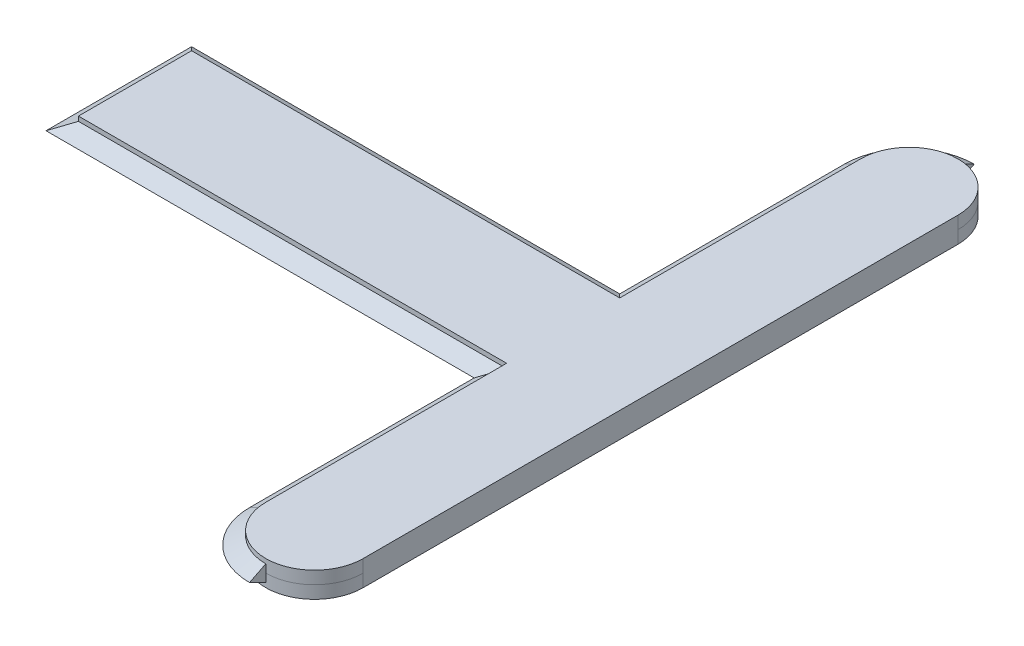
ISO-10303-21;
HEADER;
FILE_DESCRIPTION(('STEP AP214'),'2;1');
FILE_NAME('part.step','',(''),(''),'','','');
FILE_SCHEMA(('AUTOMOTIVE_DESIGN { 1 0 10303 214 1 1 1 1 }'));
ENDSEC;
DATA;
#1=APPLICATION_CONTEXT('core data for automotive mechanical design processes');
#2=APPLICATION_PROTOCOL_DEFINITION('international standard','automotive_design',2000,#1);
#3=PRODUCT_CONTEXT('',#1,'mechanical');
#4=PRODUCT('Part','Part','',(#3));
#5=PRODUCT_RELATED_PRODUCT_CATEGORY('part','',(#4));
#6=PRODUCT_DEFINITION_FORMATION('','',#4);
#7=PRODUCT_DEFINITION_CONTEXT('part definition',#1,'design');
#8=PRODUCT_DEFINITION('design','',#6,#7);
#9=PRODUCT_DEFINITION_SHAPE('','',#8);
#10=(LENGTH_UNIT() NAMED_UNIT(*) SI_UNIT(.MILLI.,.METRE.));
#11=(NAMED_UNIT(*) PLANE_ANGLE_UNIT() SI_UNIT($,.RADIAN.));
#12=(NAMED_UNIT(*) SI_UNIT($,.STERADIAN.) SOLID_ANGLE_UNIT());
#13=UNCERTAINTY_MEASURE_WITH_UNIT(LENGTH_MEASURE(1.E-05),#10,'distance_accuracy_value','');
#14=(GEOMETRIC_REPRESENTATION_CONTEXT(3) GLOBAL_UNCERTAINTY_ASSIGNED_CONTEXT((#13)) GLOBAL_UNIT_ASSIGNED_CONTEXT((#10,
#11,#12)) REPRESENTATION_CONTEXT('',''));
#15=CARTESIAN_POINT('',(0.,0.,0.));
#16=DIRECTION('',(0.,0.,1.));
#17=DIRECTION('',(1.,0.,0.));
#18=AXIS2_PLACEMENT_3D('',#15,#16,#17);
#19=CARTESIAN_POINT('',(0.,6.,-13.4215536280061));
#20=DIRECTION('',(1.,0.,0.));
#21=DIRECTION('',(0.,0.,-1.));
#22=AXIS2_PLACEMENT_3D('',#19,#20,#21);
#23=PLANE('',#22);
#24=DIRECTION('',(0.,0.,-1.));
#25=VECTOR('',#24,1.);
#26=CARTESIAN_POINT('',(0.,4.91034304153466,17.7565536280061));
#27=LINE('',#26,#25);
#28=CARTESIAN_POINT('',(0.,4.91034304153466,13.4215536280061));
#29=VERTEX_POINT('',#28);
#30=CARTESIAN_POINT('',(0.,4.91034304153466,-13.4215536280061));
#31=VERTEX_POINT('',#30);
#32=EDGE_CURVE('E260',#29,#31,#27,.T.);
#33=ORIENTED_EDGE('',*,*,#32,.F.);
#34=DIRECTION('',(0.,-1.,0.));
#35=VECTOR('',#34,1.);
#36=CARTESIAN_POINT('',(0.,6.,13.4215536280061));
#37=LINE('',#36,#35);
#38=CARTESIAN_POINT('',(0.,6.,13.4215536280061));
#39=VERTEX_POINT('',#38);
#40=EDGE_CURVE('E421',#39,#29,#37,.T.);
#41=ORIENTED_EDGE('',*,*,#40,.F.);
#42=DIRECTION('',(0.,0.,1.));
#43=VECTOR('',#42,1.);
#44=CARTESIAN_POINT('',(0.,6.,-13.4215536280061));
#45=LINE('',#44,#43);
#46=CARTESIAN_POINT('',(0.,6.,-13.4215536280061));
#47=VERTEX_POINT('',#46);
#48=EDGE_CURVE('E329',#47,#39,#45,.T.);
#49=ORIENTED_EDGE('',*,*,#48,.F.);
#50=DIRECTION('',(0.,-1.,0.));
#51=VECTOR('',#50,1.);
#52=CARTESIAN_POINT('',(0.,6.,-13.4215536280061));
#53=LINE('',#52,#51);
#54=EDGE_CURVE('E388',#47,#31,#53,.T.);
#55=ORIENTED_EDGE('',*,*,#54,.T.);
#56=EDGE_LOOP('',(#33,#41,#49,#55));
#57=FACE_BOUND('',#56,.T.);
#58=ADVANCED_FACE('F47',(#57),#23,.F.);
#59=CARTESIAN_POINT('',(101.6,6.,-70.5715536280061));
#60=DIRECTION('',(1.,0.,0.));
#61=DIRECTION('',(0.,0.,-1.));
#62=AXIS2_PLACEMENT_3D('',#59,#60,#61);
#63=PLANE('',#62);
#64=DIRECTION('',(0.,0.,-1.));
#65=VECTOR('',#64,1.);
#66=CARTESIAN_POINT('',(101.6,4.91034304153466,-13.4215536280061));
#67=LINE('',#66,#65);
#68=CARTESIAN_POINT('',(101.6,4.91034304153466,-13.4215536280061));
#69=VERTEX_POINT('',#68);
#70=CARTESIAN_POINT('',(101.6,4.91034304153466,-70.5715536280061));
#71=VERTEX_POINT('',#70);
#72=EDGE_CURVE('E303',#69,#71,#67,.T.);
#73=ORIENTED_EDGE('',*,*,#72,.F.);
#74=DIRECTION('',(0.,-1.,0.));
#75=VECTOR('',#74,1.);
#76=CARTESIAN_POINT('',(101.6,6.,-13.4215536280061));
#77=LINE('',#76,#75);
#78=CARTESIAN_POINT('',(101.6,6.,-13.4215536280061));
#79=VERTEX_POINT('',#78);
#80=EDGE_CURVE('E393',#79,#69,#77,.T.);
#81=ORIENTED_EDGE('',*,*,#80,.F.);
#82=DIRECTION('',(0.,0.,1.));
#83=VECTOR('',#82,1.);
#84=CARTESIAN_POINT('',(101.6,6.,-70.5715536280061));
#85=LINE('',#84,#83);
#86=CARTESIAN_POINT('',(101.6,6.,-70.5715536280061));
#87=VERTEX_POINT('',#86);
#88=EDGE_CURVE('E349',#87,#79,#85,.T.);
#89=ORIENTED_EDGE('',*,*,#88,.F.);
#90=DIRECTION('',(0.,-1.,0.));
#91=VECTOR('',#90,1.);
#92=CARTESIAN_POINT('',(101.6,6.,-70.5715536280061));
#93=LINE('',#92,#91);
#94=EDGE_CURVE('E397',#87,#71,#93,.T.);
#95=ORIENTED_EDGE('',*,*,#94,.T.);
#96=EDGE_LOOP('',(#73,#81,#89,#95));
#97=FACE_BOUND('',#96,.T.);
#98=ADVANCED_FACE('F526',(#97),#63,.F.);
#99=CARTESIAN_POINT('',(113.157,6.,-70.5715536280061));
#100=DIRECTION('',(0.,-1.,0.));
#101=DIRECTION('',(0.,0.,-1.));
#102=AXIS2_PLACEMENT_3D('',#99,#100,#101);
#103=CYLINDRICAL_SURFACE('',#102,11.557);
#104=DIRECTION('',(0.,-1.,0.));
#105=VECTOR('',#104,1.);
#106=CARTESIAN_POINT('',(113.157,4.91034304153466,-82.1285536280061));
#107=LINE('',#106,#105);
#108=CARTESIAN_POINT('',(113.157,4.91034304153466,-82.1285536280061));
#109=VERTEX_POINT('',#108);
#110=CARTESIAN_POINT('',(113.157,3.,-82.1285536280061));
#111=VERTEX_POINT('',#110);
#112=EDGE_CURVE('E66',#109,#111,#107,.T.);
#113=ORIENTED_EDGE('',*,*,#112,.F.);
#114=CARTESIAN_POINT('',(113.157,4.91034304153466,-70.5715536280061));
#115=DIRECTION('',(0.,-1.,0.));
#116=DIRECTION('',(-1.,0.,0.));
#117=AXIS2_PLACEMENT_3D('',#114,#115,#116);
#118=CIRCLE('',#117,11.557);
#119=EDGE_CURVE('E71',#71,#109,#118,.T.);
#120=ORIENTED_EDGE('',*,*,#119,.F.);
#121=ORIENTED_EDGE('',*,*,#94,.F.);
#122=CARTESIAN_POINT('',(113.157,6.,-70.5715536280061));
#123=DIRECTION('',(0.,1.,0.));
#124=DIRECTION('',(0.,0.,1.));
#125=AXIS2_PLACEMENT_3D('',#122,#123,#124);
#126=CIRCLE('',#125,11.557);
#127=CARTESIAN_POINT('',(124.714,6.,-70.5715536280061));
#128=VERTEX_POINT('',#127);
#129=EDGE_CURVE('E346',#128,#87,#126,.T.);
#130=ORIENTED_EDGE('',*,*,#129,.F.);
#131=DIRECTION('',(0.,-1.,0.));
#132=VECTOR('',#131,1.);
#133=CARTESIAN_POINT('',(124.714,6.,-70.5715536280061));
#134=LINE('',#133,#132);
#135=CARTESIAN_POINT('',(124.714,3.,-70.5715536280061));
#136=VERTEX_POINT('',#135);
#137=EDGE_CURVE('E401',#128,#136,#134,.T.);
#138=ORIENTED_EDGE('',*,*,#137,.T.);
#139=CARTESIAN_POINT('',(113.157,3.,-70.5715536280061));
#140=DIRECTION('',(0.,-1.,0.));
#141=DIRECTION('',(0.,0.,-1.));
#142=AXIS2_PLACEMENT_3D('',#139,#140,#141);
#143=CIRCLE('',#142,11.557);
#144=EDGE_CURVE('E57',#111,#136,#143,.T.);
#145=ORIENTED_EDGE('',*,*,#144,.F.);
#146=EDGE_LOOP('',(#113,#120,#121,#130,#138,#145));
#147=FACE_BOUND('',#146,.T.);
#148=ADVANCED_FACE('F557',(#147),#103,.T.);
#149=CARTESIAN_POINT('',(101.6,6.,13.4215536280061));
#150=DIRECTION('',(1.,0.,0.));
#151=DIRECTION('',(0.,0.,-1.));
#152=AXIS2_PLACEMENT_3D('',#149,#150,#151);
#153=PLANE('',#152);
#154=DIRECTION('',(0.,0.,-1.));
#155=VECTOR('',#154,1.);
#156=CARTESIAN_POINT('',(101.6,4.91034304153466,70.5715536280061));
#157=LINE('',#156,#155);
#158=CARTESIAN_POINT('',(101.6,4.91034304153468,70.5715536280061));
#159=VERTEX_POINT('',#158);
#160=CARTESIAN_POINT('',(101.6,4.91034304153468,13.4215536280061));
#161=VERTEX_POINT('',#160);
#162=EDGE_CURVE('E211',#159,#161,#157,.T.);
#163=ORIENTED_EDGE('',*,*,#162,.F.);
#164=DIRECTION('',(0.,-1.,0.));
#165=VECTOR('',#164,1.);
#166=CARTESIAN_POINT('',(101.6,6.,70.5715536280061));
#167=LINE('',#166,#165);
#168=CARTESIAN_POINT('',(101.6,6.,70.5715536280061));
#169=VERTEX_POINT('',#168);
#170=EDGE_CURVE('E411',#169,#159,#167,.T.);
#171=ORIENTED_EDGE('',*,*,#170,.F.);
#172=DIRECTION('',(0.,0.,1.));
#173=VECTOR('',#172,1.);
#174=CARTESIAN_POINT('',(101.6,6.,13.4215536280061));
#175=LINE('',#174,#173);
#176=CARTESIAN_POINT('',(101.6,6.,13.4215536280061));
#177=VERTEX_POINT('',#176);
#178=EDGE_CURVE('E337',#177,#169,#175,.T.);
#179=ORIENTED_EDGE('',*,*,#178,.F.);
#180=DIRECTION('',(0.,-1.,0.));
#181=VECTOR('',#180,1.);
#182=CARTESIAN_POINT('',(101.6,6.,13.4215536280061));
#183=LINE('',#182,#181);
#184=EDGE_CURVE('E416',#177,#161,#183,.T.);
#185=ORIENTED_EDGE('',*,*,#184,.T.);
#186=EDGE_LOOP('',(#163,#171,#179,#185));
#187=FACE_BOUND('',#186,.T.);
#188=ADVANCED_FACE('F476',(#187),#153,.F.);
#189=CARTESIAN_POINT('',(113.157,6.,70.5715536280061));
#190=DIRECTION('',(0.,-1.,0.));
#191=DIRECTION('',(0.,0.,-1.));
#192=AXIS2_PLACEMENT_3D('',#189,#190,#191);
#193=CYLINDRICAL_SURFACE('',#192,11.557);
#194=CARTESIAN_POINT('',(113.157,4.91034304153466,70.5715536280061));
#195=DIRECTION('',(0.,-1.,0.));
#196=DIRECTION('',(0.,0.,1.));
#197=AXIS2_PLACEMENT_3D('',#194,#195,#196);
#198=CIRCLE('',#197,11.5570000000001);
#199=CARTESIAN_POINT('',(113.157,4.91034304153468,82.1285536280061));
#200=VERTEX_POINT('',#199);
#201=EDGE_CURVE('E242',#200,#159,#198,.T.);
#202=ORIENTED_EDGE('',*,*,#201,.F.);
#203=DIRECTION('',(0.,-1.,0.));
#204=VECTOR('',#203,1.);
#205=CARTESIAN_POINT('',(113.157,4.91034304153466,82.1285536280061));
#206=LINE('',#205,#204);
#207=CARTESIAN_POINT('',(113.157,3.,82.1285536280061));
#208=VERTEX_POINT('',#207);
#209=EDGE_CURVE('E59',#200,#208,#206,.T.);
#210=ORIENTED_EDGE('',*,*,#209,.T.);
#211=CARTESIAN_POINT('',(113.157,3.,70.5715536280061));
#212=DIRECTION('',(0.,-1.,0.));
#213=DIRECTION('',(0.,0.,-1.));
#214=AXIS2_PLACEMENT_3D('',#211,#212,#213);
#215=CIRCLE('',#214,11.557);
#216=CARTESIAN_POINT('',(124.714,3.,70.5715536280061));
#217=VERTEX_POINT('',#216);
#218=EDGE_CURVE('E51',#217,#208,#215,.T.);
#219=ORIENTED_EDGE('',*,*,#218,.F.);
#220=DIRECTION('',(0.,-1.,0.));
#221=VECTOR('',#220,1.);
#222=CARTESIAN_POINT('',(124.714,6.,70.5715536280061));
#223=LINE('',#222,#221);
#224=CARTESIAN_POINT('',(124.714,6.,70.5715536280061));
#225=VERTEX_POINT('',#224);
#226=EDGE_CURVE('E406',#225,#217,#223,.T.);
#227=ORIENTED_EDGE('',*,*,#226,.F.);
#228=CARTESIAN_POINT('',(113.157,6.,70.5715536280061));
#229=DIRECTION('',(0.,1.,0.));
#230=DIRECTION('',(0.,0.,1.));
#231=AXIS2_PLACEMENT_3D('',#228,#229,#230);
#232=CIRCLE('',#231,11.557);
#233=EDGE_CURVE('E340',#169,#225,#232,.T.);
#234=ORIENTED_EDGE('',*,*,#233,.F.);
#235=ORIENTED_EDGE('',*,*,#170,.T.);
#236=EDGE_LOOP('',(#202,#210,#219,#227,#234,#235));
#237=FACE_BOUND('',#236,.T.);
#238=ADVANCED_FACE('F471',(#237),#193,.T.);
#239=CARTESIAN_POINT('',(0.,6.,13.4215536280061));
#240=DIRECTION('',(0.,0.,-1.));
#241=DIRECTION('',(-1.,0.,0.));
#242=AXIS2_PLACEMENT_3D('',#239,#240,#241);
#243=PLANE('',#242);
#244=DIRECTION('',(-1.,0.,0.));
#245=VECTOR('',#244,1.);
#246=CARTESIAN_POINT('',(101.6,4.91034304153466,13.4215536280061));
#247=LINE('',#246,#245);
#248=EDGE_CURVE('E224',#161,#29,#247,.T.);
#249=ORIENTED_EDGE('',*,*,#248,.F.);
#250=ORIENTED_EDGE('',*,*,#184,.F.);
#251=DIRECTION('',(1.,0.,0.));
#252=VECTOR('',#251,1.);
#253=CARTESIAN_POINT('',(0.,6.,13.4215536280061));
#254=LINE('',#253,#252);
#255=EDGE_CURVE('E333',#39,#177,#254,.T.);
#256=ORIENTED_EDGE('',*,*,#255,.F.);
#257=ORIENTED_EDGE('',*,*,#40,.T.);
#258=EDGE_LOOP('',(#249,#250,#256,#257));
#259=FACE_BOUND('',#258,.T.);
#260=ADVANCED_FACE('F479',(#259),#243,.F.);
#261=CARTESIAN_POINT('',(113.157,1.06034304153466,-82.1285536280061));
#262=VERTEX_POINT('',#261);
#263=EDGE_CURVE('E296',#111,#262,#107,.T.);
#264=ORIENTED_EDGE('',*,*,#263,.F.);
#265=ORIENTED_EDGE('',*,*,#144,.T.);
#266=CARTESIAN_POINT('',(124.714,0.,-70.5715536280061));
#267=VERTEX_POINT('',#266);
#268=EDGE_CURVE('E400',#136,#267,#134,.T.);
#269=ORIENTED_EDGE('',*,*,#268,.T.);
#270=CARTESIAN_POINT('',(113.157,0.,-70.5715536280061));
#271=DIRECTION('',(0.,1.,0.));
#272=DIRECTION('',(0.,0.,1.));
#273=AXIS2_PLACEMENT_3D('',#270,#271,#272);
#274=CIRCLE('',#273,11.557);
#275=CARTESIAN_POINT('',(101.6,0.,-70.5715536280061));
#276=VERTEX_POINT('',#275);
#277=EDGE_CURVE('E377',#267,#276,#274,.T.);
#278=ORIENTED_EDGE('',*,*,#277,.T.);
#279=CARTESIAN_POINT('',(101.6,1.06034304153466,-70.5715536280061));
#280=VERTEX_POINT('',#279);
#281=EDGE_CURVE('E396',#280,#276,#93,.T.);
#282=ORIENTED_EDGE('',*,*,#281,.F.);
#283=CARTESIAN_POINT('',(113.157,1.06034304153466,-70.5715536280061));
#284=DIRECTION('',(0.,-1.,0.));
#285=DIRECTION('',(-1.,0.,0.));
#286=AXIS2_PLACEMENT_3D('',#283,#284,#285);
#287=CIRCLE('',#286,11.557);
#288=EDGE_CURVE('E308',#280,#262,#287,.T.);
#289=ORIENTED_EDGE('',*,*,#288,.T.);
#290=EDGE_LOOP('',(#264,#265,#269,#278,#282,#289));
#291=FACE_BOUND('',#290,.T.);
#292=ADVANCED_FACE('F536',(#291),#103,.T.);
#293=CARTESIAN_POINT('',(101.6,6.,-13.4215536280061));
#294=DIRECTION('',(0.,0.,1.));
#295=DIRECTION('',(1.,0.,0.));
#296=AXIS2_PLACEMENT_3D('',#293,#294,#295);
#297=PLANE('',#296);
#298=DIRECTION('',(1.,0.,0.));
#299=VECTOR('',#298,1.);
#300=CARTESIAN_POINT('',(-4.33500000000001,4.91034304153466,-13.4215536280061));
#301=LINE('',#300,#299);
#302=EDGE_CURVE('E265',#31,#69,#301,.T.);
#303=ORIENTED_EDGE('',*,*,#302,.F.);
#304=ORIENTED_EDGE('',*,*,#54,.F.);
#305=DIRECTION('',(-1.,0.,0.));
#306=VECTOR('',#305,1.);
#307=CARTESIAN_POINT('',(101.6,6.,-13.4215536280061));
#308=LINE('',#307,#306);
#309=EDGE_CURVE('E352',#79,#47,#308,.T.);
#310=ORIENTED_EDGE('',*,*,#309,.F.);
#311=ORIENTED_EDGE('',*,*,#80,.T.);
#312=EDGE_LOOP('',(#303,#304,#310,#311));
#313=FACE_BOUND('',#312,.T.);
#314=ADVANCED_FACE('F517',(#313),#297,.F.);
#315=CARTESIAN_POINT('',(0.,1.06034304153467,-13.4215536280061));
#316=VERTEX_POINT('',#315);
#317=CARTESIAN_POINT('',(0.,0.,-13.4215536280061));
#318=VERTEX_POINT('',#317);
#319=EDGE_CURVE('E355',#316,#318,#53,.T.);
#320=ORIENTED_EDGE('',*,*,#319,.F.);
#321=DIRECTION('',(1.,0.,0.));
#322=VECTOR('',#321,1.);
#323=CARTESIAN_POINT('',(-4.33500000000001,1.06034304153466,-13.4215536280061));
#324=LINE('',#323,#322);
#325=CARTESIAN_POINT('',(101.6,1.06034304153466,-13.4215536280061));
#326=VERTEX_POINT('',#325);
#327=EDGE_CURVE('E275',#316,#326,#324,.T.);
#328=ORIENTED_EDGE('',*,*,#327,.T.);
#329=CARTESIAN_POINT('',(101.6,0.,-13.4215536280061));
#330=VERTEX_POINT('',#329);
#331=EDGE_CURVE('E392',#326,#330,#77,.T.);
#332=ORIENTED_EDGE('',*,*,#331,.T.);
#333=DIRECTION('',(-1.,0.,0.));
#334=VECTOR('',#333,1.);
#335=CARTESIAN_POINT('',(101.6,0.,-13.4215536280061));
#336=LINE('',#335,#334);
#337=EDGE_CURVE('E334',#330,#318,#336,.T.);
#338=ORIENTED_EDGE('',*,*,#337,.T.);
#339=EDGE_LOOP('',(#320,#328,#332,#338));
#340=FACE_BOUND('',#339,.T.);
#341=ADVANCED_FACE('F495',(#340),#297,.F.);
#342=CARTESIAN_POINT('',(101.6,1.06034304153466,13.4215536280061));
#343=VERTEX_POINT('',#342);
#344=CARTESIAN_POINT('',(101.6,0.,13.4215536280061));
#345=VERTEX_POINT('',#344);
#346=EDGE_CURVE('E415',#343,#345,#183,.T.);
#347=ORIENTED_EDGE('',*,*,#346,.F.);
#348=DIRECTION('',(-1.,0.,0.));
#349=VECTOR('',#348,1.);
#350=CARTESIAN_POINT('',(101.6,1.06034304153466,13.4215536280061));
#351=LINE('',#350,#349);
#352=CARTESIAN_POINT('',(0.,1.06034304153466,13.4215536280061));
#353=VERTEX_POINT('',#352);
#354=EDGE_CURVE('E206',#343,#353,#351,.T.);
#355=ORIENTED_EDGE('',*,*,#354,.T.);
#356=CARTESIAN_POINT('',(0.,0.,13.4215536280061));
#357=VERTEX_POINT('',#356);
#358=EDGE_CURVE('E420',#353,#357,#37,.T.);
#359=ORIENTED_EDGE('',*,*,#358,.T.);
#360=DIRECTION('',(1.,0.,0.));
#361=VECTOR('',#360,1.);
#362=CARTESIAN_POINT('',(0.,0.,13.4215536280061));
#363=LINE('',#362,#361);
#364=EDGE_CURVE('E360',#357,#345,#363,.T.);
#365=ORIENTED_EDGE('',*,*,#364,.T.);
#366=EDGE_LOOP('',(#347,#355,#359,#365));
#367=FACE_BOUND('',#366,.T.);
#368=ADVANCED_FACE('F562',(#367),#243,.F.);
#369=ORIENTED_EDGE('',*,*,#358,.F.);
#370=DIRECTION('',(0.,0.,-1.));
#371=VECTOR('',#370,1.);
#372=CARTESIAN_POINT('',(0.,1.06034304153466,17.7565536280061));
#373=LINE('',#372,#371);
#374=EDGE_CURVE('E269',#353,#316,#373,.T.);
#375=ORIENTED_EDGE('',*,*,#374,.T.);
#376=ORIENTED_EDGE('',*,*,#319,.T.);
#377=DIRECTION('',(0.,0.,1.));
#378=VECTOR('',#377,1.);
#379=CARTESIAN_POINT('',(0.,0.,-13.4215536280061));
#380=LINE('',#379,#378);
#381=EDGE_CURVE('E356',#318,#357,#380,.T.);
#382=ORIENTED_EDGE('',*,*,#381,.T.);
#383=EDGE_LOOP('',(#369,#375,#376,#382));
#384=FACE_BOUND('',#383,.T.);
#385=ADVANCED_FACE('F49',(#384),#23,.F.);
#386=CARTESIAN_POINT('',(101.6,1.06034304153465,70.5715536280061));
#387=VERTEX_POINT('',#386);
#388=CARTESIAN_POINT('',(101.6,0.,70.5715536280061));
#389=VERTEX_POINT('',#388);
#390=EDGE_CURVE('E410',#387,#389,#167,.T.);
#391=ORIENTED_EDGE('',*,*,#390,.F.);
#392=DIRECTION('',(0.,0.,-1.));
#393=VECTOR('',#392,1.);
#394=CARTESIAN_POINT('',(101.6,1.06034304153466,70.5715536280061));
#395=LINE('',#394,#393);
#396=EDGE_CURVE('E238',#387,#343,#395,.T.);
#397=ORIENTED_EDGE('',*,*,#396,.T.);
#398=ORIENTED_EDGE('',*,*,#346,.T.);
#399=DIRECTION('',(0.,0.,1.));
#400=VECTOR('',#399,1.);
#401=CARTESIAN_POINT('',(101.6,0.,13.4215536280061));
#402=LINE('',#401,#400);
#403=EDGE_CURVE('E365',#345,#389,#402,.T.);
#404=ORIENTED_EDGE('',*,*,#403,.T.);
#405=EDGE_LOOP('',(#391,#397,#398,#404));
#406=FACE_BOUND('',#405,.T.);
#407=ADVANCED_FACE('F561',(#406),#153,.F.);
#408=ORIENTED_EDGE('',*,*,#218,.T.);
#409=CARTESIAN_POINT('',(113.157,1.06034304153465,82.1285536280061));
#410=VERTEX_POINT('',#409);
#411=EDGE_CURVE('E11',#208,#410,#206,.T.);
#412=ORIENTED_EDGE('',*,*,#411,.T.);
#413=CARTESIAN_POINT('',(113.157,1.06034304153466,70.5715536280061));
#414=DIRECTION('',(0.,-1.,0.));
#415=DIRECTION('',(0.,0.,1.));
#416=AXIS2_PLACEMENT_3D('',#413,#414,#415);
#417=CIRCLE('',#416,11.5570000000001);
#418=EDGE_CURVE('E450',#410,#387,#417,.T.);
#419=ORIENTED_EDGE('',*,*,#418,.T.);
#420=ORIENTED_EDGE('',*,*,#390,.T.);
#421=CARTESIAN_POINT('',(113.157,0.,70.5715536280061));
#422=DIRECTION('',(0.,1.,0.));
#423=DIRECTION('',(0.,0.,1.));
#424=AXIS2_PLACEMENT_3D('',#421,#422,#423);
#425=CIRCLE('',#424,11.557);
#426=CARTESIAN_POINT('',(124.714,0.,70.5715536280061));
#427=VERTEX_POINT('',#426);
#428=EDGE_CURVE('E369',#389,#427,#425,.T.);
#429=ORIENTED_EDGE('',*,*,#428,.T.);
#430=EDGE_CURVE('E405',#217,#427,#223,.T.);
#431=ORIENTED_EDGE('',*,*,#430,.F.);
#432=EDGE_LOOP('',(#408,#412,#419,#420,#429,#431));
#433=FACE_BOUND('',#432,.T.);
#434=ADVANCED_FACE('F434',(#433),#193,.T.);
#435=CARTESIAN_POINT('',(124.714,6.,70.5715536280061));
#436=DIRECTION('',(-1.,0.,0.));
#437=DIRECTION('',(0.,0.,1.));
#438=AXIS2_PLACEMENT_3D('',#435,#436,#437);
#439=PLANE('',#438);
#440=DIRECTION('',(0.,0.,-1.));
#441=VECTOR('',#440,1.);
#442=CARTESIAN_POINT('',(124.714,0.,70.5715536280061));
#443=LINE('',#442,#441);
#444=EDGE_CURVE('E373',#427,#267,#443,.T.);
#445=ORIENTED_EDGE('',*,*,#444,.T.);
#446=ORIENTED_EDGE('',*,*,#268,.F.);
#447=ORIENTED_EDGE('',*,*,#137,.F.);
#448=DIRECTION('',(0.,0.,-1.));
#449=VECTOR('',#448,1.);
#450=CARTESIAN_POINT('',(124.714,6.,70.5715536280061));
#451=LINE('',#450,#449);
#452=EDGE_CURVE('E343',#225,#128,#451,.T.);
#453=ORIENTED_EDGE('',*,*,#452,.F.);
#454=ORIENTED_EDGE('',*,*,#226,.T.);
#455=ORIENTED_EDGE('',*,*,#430,.T.);
#456=EDGE_LOOP('',(#445,#446,#447,#453,#454,#455));
#457=FACE_BOUND('',#456,.T.);
#458=ADVANCED_FACE('F587',(#457),#439,.F.);
#459=ORIENTED_EDGE('',*,*,#331,.F.);
#460=DIRECTION('',(0.,0.,-1.));
#461=VECTOR('',#460,1.);
#462=CARTESIAN_POINT('',(101.6,1.06034304153466,-13.4215536280061));
#463=LINE('',#462,#461);
#464=EDGE_CURVE('E287',#326,#280,#463,.T.);
#465=ORIENTED_EDGE('',*,*,#464,.T.);
#466=ORIENTED_EDGE('',*,*,#281,.T.);
#467=DIRECTION('',(0.,0.,1.));
#468=VECTOR('',#467,1.);
#469=CARTESIAN_POINT('',(101.6,0.,-70.5715536280061));
#470=LINE('',#469,#468);
#471=EDGE_CURVE('E381',#276,#330,#470,.T.);
#472=ORIENTED_EDGE('',*,*,#471,.T.);
#473=EDGE_LOOP('',(#459,#465,#466,#472));
#474=FACE_BOUND('',#473,.T.);
#475=ADVANCED_FACE('F559',(#474),#63,.F.);
#476=CARTESIAN_POINT('',(113.157,6.,70.5715536280061));
#477=DIRECTION('',(0.,1.,0.));
#478=DIRECTION('',(0.,0.,1.));
#479=AXIS2_PLACEMENT_3D('',#476,#477,#478);
#480=PLANE('',#479);
#481=ORIENTED_EDGE('',*,*,#48,.T.);
#482=ORIENTED_EDGE('',*,*,#255,.T.);
#483=ORIENTED_EDGE('',*,*,#178,.T.);
#484=ORIENTED_EDGE('',*,*,#233,.T.);
#485=ORIENTED_EDGE('',*,*,#452,.T.);
#486=ORIENTED_EDGE('',*,*,#129,.T.);
#487=ORIENTED_EDGE('',*,*,#88,.T.);
#488=ORIENTED_EDGE('',*,*,#309,.T.);
#489=EDGE_LOOP('',(#481,#482,#483,#484,#485,#486,#487,#488));
#490=FACE_BOUND('',#489,.T.);
#491=ADVANCED_FACE('F522',(#490),#480,.T.);
#492=CARTESIAN_POINT('',(113.157,0.,70.5715536280061));
#493=DIRECTION('',(0.,1.,0.));
#494=DIRECTION('',(0.,0.,1.));
#495=AXIS2_PLACEMENT_3D('',#492,#493,#494);
#496=PLANE('',#495);
#497=ORIENTED_EDGE('',*,*,#381,.F.);
#498=ORIENTED_EDGE('',*,*,#337,.F.);
#499=ORIENTED_EDGE('',*,*,#471,.F.);
#500=ORIENTED_EDGE('',*,*,#277,.F.);
#501=ORIENTED_EDGE('',*,*,#444,.F.);
#502=ORIENTED_EDGE('',*,*,#428,.F.);
#503=ORIENTED_EDGE('',*,*,#403,.F.);
#504=ORIENTED_EDGE('',*,*,#364,.F.);
#505=EDGE_LOOP('',(#497,#498,#499,#500,#501,#502,#503,#504));
#506=FACE_BOUND('',#505,.T.);
#507=ADVANCED_FACE('F541',(#506),#496,.F.);
#508=CARTESIAN_POINT('',(113.157,0.,0.));
#509=DIRECTION('',(-1.,0.,0.));
#510=DIRECTION('',(0.,0.,1.));
#511=AXIS2_PLACEMENT_3D('',#508,#509,#510);
#512=PLANE('',#511);
#513=DIRECTION('',(0.,0.447213595499957,0.894427190999916));
#514=VECTOR('',#513,1.);
#515=CARTESIAN_POINT('',(113.157,4.91034304153466,-82.1285536280061));
#516=LINE('',#515,#514);
#517=CARTESIAN_POINT('',(113.157,2.98534304153466,-85.9785536280061));
#518=VERTEX_POINT('',#517);
#519=EDGE_CURVE('E299',#518,#109,#516,.T.);
#520=ORIENTED_EDGE('',*,*,#519,.T.);
#521=ORIENTED_EDGE('',*,*,#112,.T.);
#522=ORIENTED_EDGE('',*,*,#263,.T.);
#523=DIRECTION('',(0.,0.447213595499957,-0.894427190999916));
#524=VECTOR('',#523,1.);
#525=CARTESIAN_POINT('',(113.157,1.06034304153466,-82.1285536280061));
#526=LINE('',#525,#524);
#527=EDGE_CURVE('E315',#262,#518,#526,.T.);
#528=ORIENTED_EDGE('',*,*,#527,.T.);
#529=EDGE_LOOP('',(#520,#521,#522,#528));
#530=FACE_BOUND('',#529,.T.);
#531=ADVANCED_FACE('F538',(#530),#512,.F.);
#532=CARTESIAN_POINT('',(113.157,0.,0.));
#533=DIRECTION('',(1.,0.,0.));
#534=DIRECTION('',(0.,0.,-1.));
#535=AXIS2_PLACEMENT_3D('',#532,#533,#534);
#536=PLANE('',#535);
#537=DIRECTION('',(0.,0.447213595499957,-0.894427190999916));
#538=VECTOR('',#537,1.);
#539=CARTESIAN_POINT('',(113.157,4.91034304153466,82.1285536280061));
#540=LINE('',#539,#538);
#541=CARTESIAN_POINT('',(113.157,2.98534304153466,85.9785536280061));
#542=VERTEX_POINT('',#541);
#543=EDGE_CURVE('E444',#542,#200,#540,.T.);
#544=ORIENTED_EDGE('',*,*,#543,.F.);
#545=DIRECTION('',(0.,0.447213595499957,0.894427190999916));
#546=VECTOR('',#545,1.);
#547=CARTESIAN_POINT('',(113.157,1.06034304153466,82.1285536280061));
#548=LINE('',#547,#546);
#549=EDGE_CURVE('E361',#410,#542,#548,.T.);
#550=ORIENTED_EDGE('',*,*,#549,.F.);
#551=ORIENTED_EDGE('',*,*,#411,.F.);
#552=ORIENTED_EDGE('',*,*,#209,.F.);
#553=EDGE_LOOP('',(#544,#550,#551,#552));
#554=FACE_BOUND('',#553,.T.);
#555=ADVANCED_FACE('F440',(#554),#536,.T.);
#556=CARTESIAN_POINT('',(101.6,1.06034304153466,-13.4215536280061));
#557=DIRECTION('',(-0.447213595499957,-0.894427190999916,0.));
#558=DIRECTION('',(0.894427190999916,-0.447213595499958,0.));
#559=AXIS2_PLACEMENT_3D('',#556,#557,#558);
#560=PLANE('',#559);
#561=DIRECTION('',(0.666666666666667,-0.333333333333333,0.666666666666667));
#562=VECTOR('',#561,1.);
#563=CARTESIAN_POINT('',(54.5177777777778,24.6014541526458,-60.5037758502283));
#564=LINE('',#563,#562);
#565=CARTESIAN_POINT('',(97.75,2.98534304153467,-17.2715536280061));
#566=VERTEX_POINT('',#565);
#567=EDGE_CURVE('E279',#566,#326,#564,.T.);
#568=ORIENTED_EDGE('',*,*,#567,.F.);
#569=DIRECTION('',(0.,0.,-1.));
#570=VECTOR('',#569,1.);
#571=CARTESIAN_POINT('',(97.75,2.98534304153466,-13.4215536280061));
#572=LINE('',#571,#570);
#573=CARTESIAN_POINT('',(97.75,2.98534304153466,-70.5715536280061));
#574=VERTEX_POINT('',#573);
#575=EDGE_CURVE('E312',#566,#574,#572,.T.);
#576=ORIENTED_EDGE('',*,*,#575,.T.);
#577=DIRECTION('',(-0.894427190999916,0.447213595499957,0.));
#578=VECTOR('',#577,1.);
#579=CARTESIAN_POINT('',(101.6,1.06034304153466,-70.5715536280061));
#580=LINE('',#579,#578);
#581=EDGE_CURVE('E323',#280,#574,#580,.T.);
#582=ORIENTED_EDGE('',*,*,#581,.F.);
#583=ORIENTED_EDGE('',*,*,#464,.F.);
#584=EDGE_LOOP('',(#568,#576,#582,#583));
#585=FACE_BOUND('',#584,.T.);
#586=ADVANCED_FACE('F506',(#585),#560,.T.);
#587=CARTESIAN_POINT('',(101.6,4.91034304153466,-13.4215536280061));
#588=DIRECTION('',(-0.447213595499957,0.894427190999916,0.));
#589=DIRECTION('',(-0.894427190999916,-0.447213595499957,0.));
#590=AXIS2_PLACEMENT_3D('',#587,#588,#589);
#591=PLANE('',#590);
#592=DIRECTION('',(-0.666666666666667,-0.333333333333333,-0.666666666666667));
#593=VECTOR('',#592,1.);
#594=CARTESIAN_POINT('',(54.5177777777778,-18.6307680695764,-60.5037758502283));
#595=LINE('',#594,#593);
#596=EDGE_CURVE('E283',#69,#566,#595,.T.);
#597=ORIENTED_EDGE('',*,*,#596,.F.);
#598=ORIENTED_EDGE('',*,*,#72,.T.);
#599=DIRECTION('',(0.894427190999916,0.447213595499957,0.));
#600=VECTOR('',#599,1.);
#601=CARTESIAN_POINT('',(101.6,4.91034304153466,-70.5715536280061));
#602=LINE('',#601,#600);
#603=EDGE_CURVE('E307',#574,#71,#602,.T.);
#604=ORIENTED_EDGE('',*,*,#603,.F.);
#605=ORIENTED_EDGE('',*,*,#575,.F.);
#606=EDGE_LOOP('',(#597,#598,#604,#605));
#607=FACE_BOUND('',#606,.T.);
#608=ADVANCED_FACE('F512',(#607),#591,.T.);
#609=CARTESIAN_POINT('',(113.157,1.06034304153466,-70.5715536280061));
#610=DIRECTION('',(0.,1.,0.));
#611=DIRECTION('',(0.,0.,1.));
#612=AXIS2_PLACEMENT_3D('',#609,#610,#611);
#613=CONICAL_SURFACE('',#612,11.557,1.10714871779409);
#614=CARTESIAN_POINT('',(113.157,2.98534304153466,-70.5715536280061));
#615=DIRECTION('',(0.,-1.,0.));
#616=DIRECTION('',(-1.,0.,0.));
#617=AXIS2_PLACEMENT_3D('',#614,#615,#616);
#618=CIRCLE('',#617,15.407);
#619=EDGE_CURVE('E302',#574,#518,#618,.T.);
#620=ORIENTED_EDGE('',*,*,#619,.T.);
#621=ORIENTED_EDGE('',*,*,#527,.F.);
#622=ORIENTED_EDGE('',*,*,#288,.F.);
#623=ORIENTED_EDGE('',*,*,#581,.T.);
#624=EDGE_LOOP('',(#620,#621,#622,#623));
#625=FACE_BOUND('',#624,.T.);
#626=ADVANCED_FACE('F532',(#625),#613,.T.);
#627=CARTESIAN_POINT('',(113.157,2.98534304153466,-70.5715536280061));
#628=DIRECTION('',(0.,-1.,0.));
#629=DIRECTION('',(0.,0.,-1.));
#630=AXIS2_PLACEMENT_3D('',#627,#628,#629);
#631=CONICAL_SURFACE('',#630,15.407,1.10714871779409);
#632=ORIENTED_EDGE('',*,*,#119,.T.);
#633=ORIENTED_EDGE('',*,*,#519,.F.);
#634=ORIENTED_EDGE('',*,*,#619,.F.);
#635=ORIENTED_EDGE('',*,*,#603,.T.);
#636=EDGE_LOOP('',(#632,#633,#634,#635));
#637=FACE_BOUND('',#636,.T.);
#638=ADVANCED_FACE('F528',(#637),#631,.T.);
#639=CARTESIAN_POINT('',(-4.33500000000001,1.06034304153466,-13.4215536280061));
#640=DIRECTION('',(0.,-0.894427190999916,-0.447213595499957));
#641=DIRECTION('',(0.,0.447213595499957,-0.894427190999916));
#642=AXIS2_PLACEMENT_3D('',#639,#640,#641);
#643=PLANE('',#642);
#644=DIRECTION('',(1.,0.,0.));
#645=VECTOR('',#644,1.);
#646=CARTESIAN_POINT('',(-4.33500000000001,2.98534304153466,-17.2715536280061));
#647=LINE('',#646,#645);
#648=CARTESIAN_POINT('',(-3.85000000000001,2.98534304153466,-17.2715536280061));
#649=VERTEX_POINT('',#648);
#650=EDGE_CURVE('E278',#649,#566,#647,.T.);
#651=ORIENTED_EDGE('',*,*,#650,.T.);
#652=ORIENTED_EDGE('',*,*,#567,.T.);
#653=ORIENTED_EDGE('',*,*,#327,.F.);
#654=DIRECTION('',(0.666666666666667,-0.333333333333333,0.666666666666667));
#655=VECTOR('',#654,1.);
#656=CARTESIAN_POINT('',(13.8569365582276,-5.86812523757913,0.435382930221551));
#657=LINE('',#656,#655);
#658=EDGE_CURVE('E259',#649,#316,#657,.T.);
#659=ORIENTED_EDGE('',*,*,#658,.F.);
#660=EDGE_LOOP('',(#651,#652,#653,#659));
#661=FACE_BOUND('',#660,.T.);
#662=ADVANCED_FACE('F501',(#661),#643,.T.);
#663=CARTESIAN_POINT('',(-4.33500000000001,4.91034304153466,-13.4215536280061));
#664=DIRECTION('',(0.,0.894427190999916,-0.447213595499957));
#665=DIRECTION('',(0.,0.447213595499957,0.894427190999916));
#666=AXIS2_PLACEMENT_3D('',#663,#664,#665);
#667=PLANE('',#666);
#668=ORIENTED_EDGE('',*,*,#302,.T.);
#669=ORIENTED_EDGE('',*,*,#596,.T.);
#670=ORIENTED_EDGE('',*,*,#650,.F.);
#671=DIRECTION('',(-0.666666666666667,-0.333333333333333,-0.666666666666667));
#672=VECTOR('',#671,1.);
#673=CARTESIAN_POINT('',(13.8569365582276,11.8388113206485,0.435382930221551));
#674=LINE('',#673,#672);
#675=EDGE_CURVE('E251',#31,#649,#674,.T.);
#676=ORIENTED_EDGE('',*,*,#675,.F.);
#677=EDGE_LOOP('',(#668,#669,#670,#676));
#678=FACE_BOUND('',#677,.T.);
#679=ADVANCED_FACE('F514',(#678),#667,.T.);
#680=CARTESIAN_POINT('',(0.,4.91034304153466,17.7565536280061));
#681=DIRECTION('',(-0.447213595499957,0.894427190999916,0.));
#682=DIRECTION('',(-0.894427190999916,-0.447213595499957,0.));
#683=AXIS2_PLACEMENT_3D('',#680,#681,#682);
#684=PLANE('',#683);
#685=ORIENTED_EDGE('',*,*,#32,.T.);
#686=ORIENTED_EDGE('',*,*,#675,.T.);
#687=DIRECTION('',(0.,0.,-1.));
#688=VECTOR('',#687,1.);
#689=CARTESIAN_POINT('',(-3.85000000000001,2.98534304153466,17.7565536280061));
#690=LINE('',#689,#688);
#691=CARTESIAN_POINT('',(-3.84999999999999,2.98534304153466,17.2715536280061));
#692=VERTEX_POINT('',#691);
#693=EDGE_CURVE('E264',#692,#649,#690,.T.);
#694=ORIENTED_EDGE('',*,*,#693,.F.);
#695=DIRECTION('',(-0.666666666666667,-0.333333333333333,0.666666666666667));
#696=VECTOR('',#695,1.);
#697=CARTESIAN_POINT('',(45.1555555555556,27.4881208193124,-31.7340019275495));
#698=LINE('',#697,#696);
#699=EDGE_CURVE('E222',#29,#692,#698,.T.);
#700=ORIENTED_EDGE('',*,*,#699,.F.);
#701=EDGE_LOOP('',(#685,#686,#694,#700));
#702=FACE_BOUND('',#701,.T.);
#703=ADVANCED_FACE('F485',(#702),#684,.T.);
#704=CARTESIAN_POINT('',(0.,1.06034304153466,17.7565536280061));
#705=DIRECTION('',(-0.447213595499957,-0.894427190999916,0.));
#706=DIRECTION('',(0.894427190999916,-0.447213595499958,0.));
#707=AXIS2_PLACEMENT_3D('',#704,#705,#706);
#708=PLANE('',#707);
#709=ORIENTED_EDGE('',*,*,#693,.T.);
#710=ORIENTED_EDGE('',*,*,#658,.T.);
#711=ORIENTED_EDGE('',*,*,#374,.F.);
#712=DIRECTION('',(0.666666666666667,-0.333333333333333,-0.666666666666667));
#713=VECTOR('',#712,1.);
#714=CARTESIAN_POINT('',(45.1555555555556,-21.5174347362431,-31.7340019275495));
#715=LINE('',#714,#713);
#716=EDGE_CURVE('E248',#692,#353,#715,.T.);
#717=ORIENTED_EDGE('',*,*,#716,.F.);
#718=EDGE_LOOP('',(#709,#710,#711,#717));
#719=FACE_BOUND('',#718,.T.);
#720=ADVANCED_FACE('F488',(#719),#708,.T.);
#721=CARTESIAN_POINT('',(101.6,4.91034304153466,13.4215536280061));
#722=DIRECTION('',(0.,0.894427190999916,0.447213595499957));
#723=DIRECTION('',(0.,-0.447213595499957,0.894427190999916));
#724=AXIS2_PLACEMENT_3D('',#721,#722,#723);
#725=PLANE('',#724);
#726=ORIENTED_EDGE('',*,*,#248,.T.);
#727=ORIENTED_EDGE('',*,*,#699,.T.);
#728=DIRECTION('',(-1.,0.,0.));
#729=VECTOR('',#728,1.);
#730=CARTESIAN_POINT('',(101.6,2.98534304153466,17.2715536280061));
#731=LINE('',#730,#729);
#732=CARTESIAN_POINT('',(97.75,2.98534304153467,17.2715536280061));
#733=VERTEX_POINT('',#732);
#734=EDGE_CURVE('E205',#733,#692,#731,.T.);
#735=ORIENTED_EDGE('',*,*,#734,.F.);
#736=DIRECTION('',(-0.666666666666667,-0.333333333333333,0.666666666666667));
#737=VECTOR('',#736,1.);
#738=CARTESIAN_POINT('',(76.2,-7.78965695846532,38.8215536280061));
#739=LINE('',#738,#737);
#740=EDGE_CURVE('E212',#161,#733,#739,.T.);
#741=ORIENTED_EDGE('',*,*,#740,.F.);
#742=EDGE_LOOP('',(#726,#727,#735,#741));
#743=FACE_BOUND('',#742,.T.);
#744=ADVANCED_FACE('F219',(#743),#725,.T.);
#745=CARTESIAN_POINT('',(101.6,1.06034304153466,13.4215536280061));
#746=DIRECTION('',(0.,-0.894427190999916,0.447213595499957));
#747=DIRECTION('',(0.,-0.447213595499958,-0.894427190999916));
#748=AXIS2_PLACEMENT_3D('',#745,#746,#747);
#749=PLANE('',#748);
#750=ORIENTED_EDGE('',*,*,#734,.T.);
#751=ORIENTED_EDGE('',*,*,#716,.T.);
#752=ORIENTED_EDGE('',*,*,#354,.F.);
#753=DIRECTION('',(0.666666666666667,-0.333333333333333,-0.666666666666667));
#754=VECTOR('',#753,1.);
#755=CARTESIAN_POINT('',(76.2,13.7603430415346,38.8215536280061));
#756=LINE('',#755,#754);
#757=EDGE_CURVE('E201',#733,#343,#756,.T.);
#758=ORIENTED_EDGE('',*,*,#757,.F.);
#759=EDGE_LOOP('',(#750,#751,#752,#758));
#760=FACE_BOUND('',#759,.T.);
#761=ADVANCED_FACE('F203',(#760),#749,.T.);
#762=CARTESIAN_POINT('',(113.157,1.06034304153466,70.5715536280061));
#763=DIRECTION('',(0.,1.,0.));
#764=DIRECTION('',(0.,0.,1.));
#765=AXIS2_PLACEMENT_3D('',#762,#763,#764);
#766=CONICAL_SURFACE('',#765,11.5570000000001,1.10714871779409);
#767=CARTESIAN_POINT('',(113.157,2.98534304153466,70.5715536280061));
#768=DIRECTION('',(0.,-1.,0.));
#769=DIRECTION('',(0.,0.,1.));
#770=AXIS2_PLACEMENT_3D('',#767,#768,#769);
#771=CIRCLE('',#770,15.4070000000001);
#772=CARTESIAN_POINT('',(97.75,2.98534304153466,70.5715536280061));
#773=VERTEX_POINT('',#772);
#774=EDGE_CURVE('E457',#542,#773,#771,.T.);
#775=ORIENTED_EDGE('',*,*,#774,.T.);
#776=DIRECTION('',(-0.894427190999916,0.447213595499957,0.));
#777=VECTOR('',#776,1.);
#778=CARTESIAN_POINT('',(101.6,1.06034304153466,70.5715536280061));
#779=LINE('',#778,#777);
#780=EDGE_CURVE('E236',#387,#773,#779,.T.);
#781=ORIENTED_EDGE('',*,*,#780,.F.);
#782=ORIENTED_EDGE('',*,*,#418,.F.);
#783=ORIENTED_EDGE('',*,*,#549,.T.);
#784=EDGE_LOOP('',(#775,#781,#782,#783));
#785=FACE_BOUND('',#784,.T.);
#786=ADVANCED_FACE('F451',(#785),#766,.T.);
#787=CARTESIAN_POINT('',(113.157,2.98534304153466,70.5715536280061));
#788=DIRECTION('',(0.,-1.,0.));
#789=DIRECTION('',(0.,0.,-1.));
#790=AXIS2_PLACEMENT_3D('',#787,#788,#789);
#791=CONICAL_SURFACE('',#790,15.4070000000001,1.10714871779409);
#792=ORIENTED_EDGE('',*,*,#201,.T.);
#793=DIRECTION('',(0.894427190999916,0.447213595499957,0.));
#794=VECTOR('',#793,1.);
#795=CARTESIAN_POINT('',(101.6,4.91034304153466,70.5715536280061));
#796=LINE('',#795,#794);
#797=EDGE_CURVE('E462',#773,#159,#796,.T.);
#798=ORIENTED_EDGE('',*,*,#797,.F.);
#799=ORIENTED_EDGE('',*,*,#774,.F.);
#800=ORIENTED_EDGE('',*,*,#543,.T.);
#801=EDGE_LOOP('',(#792,#798,#799,#800));
#802=FACE_BOUND('',#801,.T.);
#803=ADVANCED_FACE('F470',(#802),#791,.T.);
#804=CARTESIAN_POINT('',(101.6,1.06034304153466,70.5715536280061));
#805=DIRECTION('',(-0.447213595499957,-0.894427190999916,0.));
#806=DIRECTION('',(0.894427190999916,-0.447213595499958,0.));
#807=AXIS2_PLACEMENT_3D('',#804,#805,#806);
#808=PLANE('',#807);
#809=DIRECTION('',(0.,0.,-1.));
#810=VECTOR('',#809,1.);
#811=CARTESIAN_POINT('',(97.75,2.98534304153466,70.5715536280061));
#812=LINE('',#811,#810);
#813=EDGE_CURVE('E229',#773,#733,#812,.T.);
#814=ORIENTED_EDGE('',*,*,#813,.T.);
#815=ORIENTED_EDGE('',*,*,#757,.T.);
#816=ORIENTED_EDGE('',*,*,#396,.F.);
#817=ORIENTED_EDGE('',*,*,#780,.T.);
#818=EDGE_LOOP('',(#814,#815,#816,#817));
#819=FACE_BOUND('',#818,.T.);
#820=ADVANCED_FACE('F234',(#819),#808,.T.);
#821=CARTESIAN_POINT('',(101.6,4.91034304153466,70.5715536280061));
#822=DIRECTION('',(-0.447213595499957,0.894427190999916,0.));
#823=DIRECTION('',(-0.894427190999916,-0.447213595499957,0.));
#824=AXIS2_PLACEMENT_3D('',#821,#822,#823);
#825=PLANE('',#824);
#826=ORIENTED_EDGE('',*,*,#162,.T.);
#827=ORIENTED_EDGE('',*,*,#740,.T.);
#828=ORIENTED_EDGE('',*,*,#813,.F.);
#829=ORIENTED_EDGE('',*,*,#797,.T.);
#830=EDGE_LOOP('',(#826,#827,#828,#829));
#831=FACE_BOUND('',#830,.T.);
#832=ADVANCED_FACE('F227',(#831),#825,.T.);
#833=CLOSED_SHELL('',(#58,#98,#148,#188,#238,#260,#292,#314,#341,#368,#385,#407,#434,#458,#475,
#491,#507,#531,#555,#586,#608,#626,#638,#662,#679,#703,#720,#744,#761,#786,#803,#820,#832));
#834=MANIFOLD_SOLID_BREP('B2',#833);
#835=ADVANCED_BREP_SHAPE_REPRESENTATION('',(#18,#834),#14);
#836=SHAPE_DEFINITION_REPRESENTATION(#9,#835);
ENDSEC;
END-ISO-10303-21;
